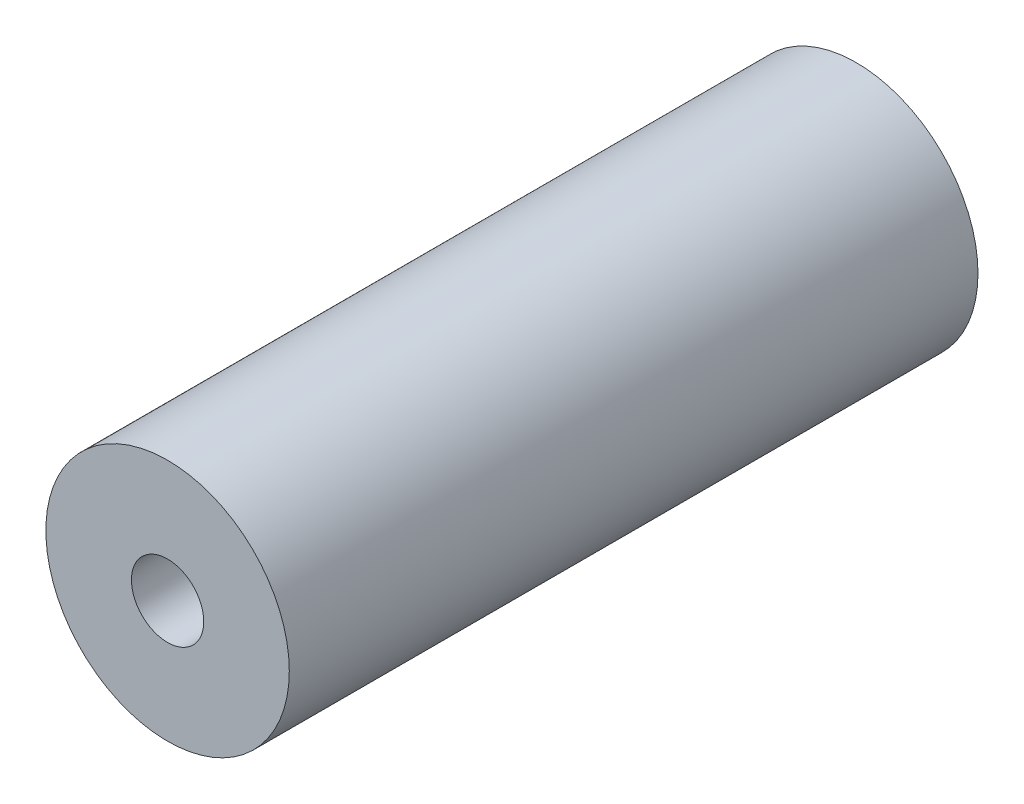
ISO-10303-21;
HEADER;
FILE_DESCRIPTION(('STEP AP214'),'2;1');
FILE_NAME('part.step','',(''),(''),'','','');
FILE_SCHEMA(('AUTOMOTIVE_DESIGN { 1 0 10303 214 1 1 1 1 }'));
ENDSEC;
DATA;
#1=APPLICATION_CONTEXT('core data for automotive mechanical design processes');
#2=APPLICATION_PROTOCOL_DEFINITION('international standard','automotive_design',2000,#1);
#3=PRODUCT_CONTEXT('',#1,'mechanical');
#4=PRODUCT('Part','Part','',(#3));
#5=PRODUCT_RELATED_PRODUCT_CATEGORY('part','',(#4));
#6=PRODUCT_DEFINITION_FORMATION('','',#4);
#7=PRODUCT_DEFINITION_CONTEXT('part definition',#1,'design');
#8=PRODUCT_DEFINITION('design','',#6,#7);
#9=PRODUCT_DEFINITION_SHAPE('','',#8);
#10=(LENGTH_UNIT() NAMED_UNIT(*) SI_UNIT(.MILLI.,.METRE.));
#11=(NAMED_UNIT(*) PLANE_ANGLE_UNIT() SI_UNIT($,.RADIAN.));
#12=(NAMED_UNIT(*) SI_UNIT($,.STERADIAN.) SOLID_ANGLE_UNIT());
#13=UNCERTAINTY_MEASURE_WITH_UNIT(LENGTH_MEASURE(1.E-05),#10,'distance_accuracy_value','');
#14=(GEOMETRIC_REPRESENTATION_CONTEXT(3) GLOBAL_UNCERTAINTY_ASSIGNED_CONTEXT((#13)) GLOBAL_UNIT_ASSIGNED_CONTEXT((#10,
#11,#12)) REPRESENTATION_CONTEXT('',''));
#15=CARTESIAN_POINT('',(0.,0.,0.));
#16=DIRECTION('',(0.,0.,1.));
#17=DIRECTION('',(1.,0.,0.));
#18=AXIS2_PLACEMENT_3D('',#15,#16,#17);
#19=CARTESIAN_POINT('',(0.,0.,40.));
#20=DIRECTION('',(0.,0.,-1.));
#21=DIRECTION('',(-1.,0.,0.));
#22=AXIS2_PLACEMENT_3D('',#19,#20,#21);
#23=CYLINDRICAL_SURFACE('',#22,7.07);
#24=CARTESIAN_POINT('',(0.,0.,40.));
#25=DIRECTION('',(0.,0.,1.));
#26=DIRECTION('',(1.,0.,0.));
#27=AXIS2_PLACEMENT_3D('',#24,#25,#26);
#28=CIRCLE('',#27,7.07);
#29=CARTESIAN_POINT('',(7.07,0.,40.));
#30=VERTEX_POINT('',#29);
#31=EDGE_CURVE('E11',#30,#30,#28,.T.);
#32=ORIENTED_EDGE('',*,*,#31,.F.);
#33=EDGE_LOOP('',(#32));
#34=FACE_BOUND('',#33,.T.);
#35=CARTESIAN_POINT('',(0.,0.,0.));
#36=DIRECTION('',(0.,0.,1.));
#37=DIRECTION('',(1.,0.,0.));
#38=AXIS2_PLACEMENT_3D('',#35,#36,#37);
#39=CIRCLE('',#38,7.07);
#40=CARTESIAN_POINT('',(7.07,0.,0.));
#41=VERTEX_POINT('',#40);
#42=EDGE_CURVE('E54',#41,#41,#39,.T.);
#43=ORIENTED_EDGE('',*,*,#42,.T.);
#44=EDGE_LOOP('',(#43));
#45=FACE_BOUND('',#44,.T.);
#46=ADVANCED_FACE('F51',(#34,#45),#23,.T.);
#47=CARTESIAN_POINT('',(0.,0.,40.));
#48=DIRECTION('',(0.,0.,1.));
#49=DIRECTION('',(1.,0.,0.));
#50=AXIS2_PLACEMENT_3D('',#47,#48,#49);
#51=PLANE('',#50);
#52=CARTESIAN_POINT('',(0.,0.,40.));
#53=DIRECTION('',(0.,0.,1.));
#54=DIRECTION('',(1.,0.,0.));
#55=AXIS2_PLACEMENT_3D('',#52,#53,#54);
#56=CIRCLE('',#55,2.09999999999999);
#57=CARTESIAN_POINT('',(2.09999999999999,0.,40.));
#58=VERTEX_POINT('',#57);
#59=EDGE_CURVE('E76',#58,#58,#56,.T.);
#60=ORIENTED_EDGE('',*,*,#59,.F.);
#61=EDGE_LOOP('',(#60));
#62=FACE_BOUND('',#61,.T.);
#63=ORIENTED_EDGE('',*,*,#31,.T.);
#64=EDGE_LOOP('',(#63));
#65=FACE_BOUND('',#64,.T.);
#66=ADVANCED_FACE('F99',(#62,#65),#51,.T.);
#67=CARTESIAN_POINT('',(0.,0.,0.));
#68=DIRECTION('',(0.,0.,1.));
#69=DIRECTION('',(1.,0.,0.));
#70=AXIS2_PLACEMENT_3D('',#67,#68,#69);
#71=PLANE('',#70);
#72=CARTESIAN_POINT('',(0.,0.,0.));
#73=DIRECTION('',(0.,0.,-1.));
#74=DIRECTION('',(-1.,0.,0.));
#75=AXIS2_PLACEMENT_3D('',#72,#73,#74);
#76=CIRCLE('',#75,2.09999999999999);
#77=CARTESIAN_POINT('',(-2.09999999999999,0.,0.));
#78=VERTEX_POINT('',#77);
#79=EDGE_CURVE('E77',#78,#78,#76,.T.);
#80=ORIENTED_EDGE('',*,*,#79,.F.);
#81=EDGE_LOOP('',(#80));
#82=FACE_BOUND('',#81,.T.);
#83=ORIENTED_EDGE('',*,*,#42,.F.);
#84=EDGE_LOOP('',(#83));
#85=FACE_BOUND('',#84,.T.);
#86=ADVANCED_FACE('F96',(#82,#85),#71,.F.);
#87=CARTESIAN_POINT('',(0.,0.,27.6));
#88=DIRECTION('',(0.,0.,1.));
#89=DIRECTION('',(1.,0.,0.));
#90=AXIS2_PLACEMENT_3D('',#87,#88,#89);
#91=CONICAL_SURFACE('',#90,2.09999999999999,1.02974425867665);
#92=CARTESIAN_POINT('',(0.,0.,26.3381927000421));
#93=VERTEX_POINT('',#92);
#94=VERTEX_LOOP('',#93);
#95=FACE_BOUND('',#94,.T.);
#96=CARTESIAN_POINT('',(0.,0.,27.6));
#97=DIRECTION('',(0.,0.,1.));
#98=DIRECTION('',(1.,0.,0.));
#99=AXIS2_PLACEMENT_3D('',#96,#97,#98);
#100=CIRCLE('',#99,2.09999999999999);
#101=CARTESIAN_POINT('',(2.09999999999999,0.,27.6));
#102=VERTEX_POINT('',#101);
#103=EDGE_CURVE('E82',#102,#102,#100,.T.);
#104=ORIENTED_EDGE('',*,*,#103,.T.);
#105=EDGE_LOOP('',(#104));
#106=FACE_BOUND('',#105,.T.);
#107=ADVANCED_FACE('F98',(#95,#106),#91,.F.);
#108=CARTESIAN_POINT('',(0.,0.,40.));
#109=DIRECTION('',(0.,0.,1.));
#110=DIRECTION('',(1.,0.,0.));
#111=AXIS2_PLACEMENT_3D('',#108,#109,#110);
#112=CYLINDRICAL_SURFACE('',#111,2.09999999999999);
#113=ORIENTED_EDGE('',*,*,#103,.F.);
#114=EDGE_LOOP('',(#113));
#115=FACE_BOUND('',#114,.T.);
#116=ORIENTED_EDGE('',*,*,#59,.T.);
#117=EDGE_LOOP('',(#116));
#118=FACE_BOUND('',#117,.T.);
#119=ADVANCED_FACE('F69',(#115,#118),#112,.F.);
#120=CARTESIAN_POINT('',(0.,0.,12.4));
#121=DIRECTION('',(0.,0.,-1.));
#122=DIRECTION('',(-1.,0.,0.));
#123=AXIS2_PLACEMENT_3D('',#120,#121,#122);
#124=CONICAL_SURFACE('',#123,2.09999999999999,1.02974425867665);
#125=CARTESIAN_POINT('',(0.,0.,13.6618072999579));
#126=VERTEX_POINT('',#125);
#127=VERTEX_LOOP('',#126);
#128=FACE_BOUND('',#127,.T.);
#129=CARTESIAN_POINT('',(0.,0.,12.4));
#130=DIRECTION('',(0.,0.,-1.));
#131=DIRECTION('',(-1.,0.,0.));
#132=AXIS2_PLACEMENT_3D('',#129,#130,#131);
#133=CIRCLE('',#132,2.09999999999999);
#134=CARTESIAN_POINT('',(-2.09999999999999,0.,12.4));
#135=VERTEX_POINT('',#134);
#136=EDGE_CURVE('E73',#135,#135,#133,.T.);
#137=ORIENTED_EDGE('',*,*,#136,.T.);
#138=EDGE_LOOP('',(#137));
#139=FACE_BOUND('',#138,.T.);
#140=ADVANCED_FACE('F65',(#128,#139),#124,.F.);
#141=CARTESIAN_POINT('',(0.,0.,0.));
#142=DIRECTION('',(0.,0.,-1.));
#143=DIRECTION('',(-1.,0.,0.));
#144=AXIS2_PLACEMENT_3D('',#141,#142,#143);
#145=CYLINDRICAL_SURFACE('',#144,2.09999999999999);
#146=ORIENTED_EDGE('',*,*,#136,.F.);
#147=EDGE_LOOP('',(#146));
#148=FACE_BOUND('',#147,.T.);
#149=ORIENTED_EDGE('',*,*,#79,.T.);
#150=EDGE_LOOP('',(#149));
#151=FACE_BOUND('',#150,.T.);
#152=ADVANCED_FACE('F68',(#148,#151),#145,.F.);
#153=CLOSED_SHELL('',(#46,#66,#86,#107,#119,#140,#152));
#154=MANIFOLD_SOLID_BREP('B2',#153);
#155=ADVANCED_BREP_SHAPE_REPRESENTATION('',(#18,#154),#14);
#156=SHAPE_DEFINITION_REPRESENTATION(#9,#155);
ENDSEC;
END-ISO-10303-21;
